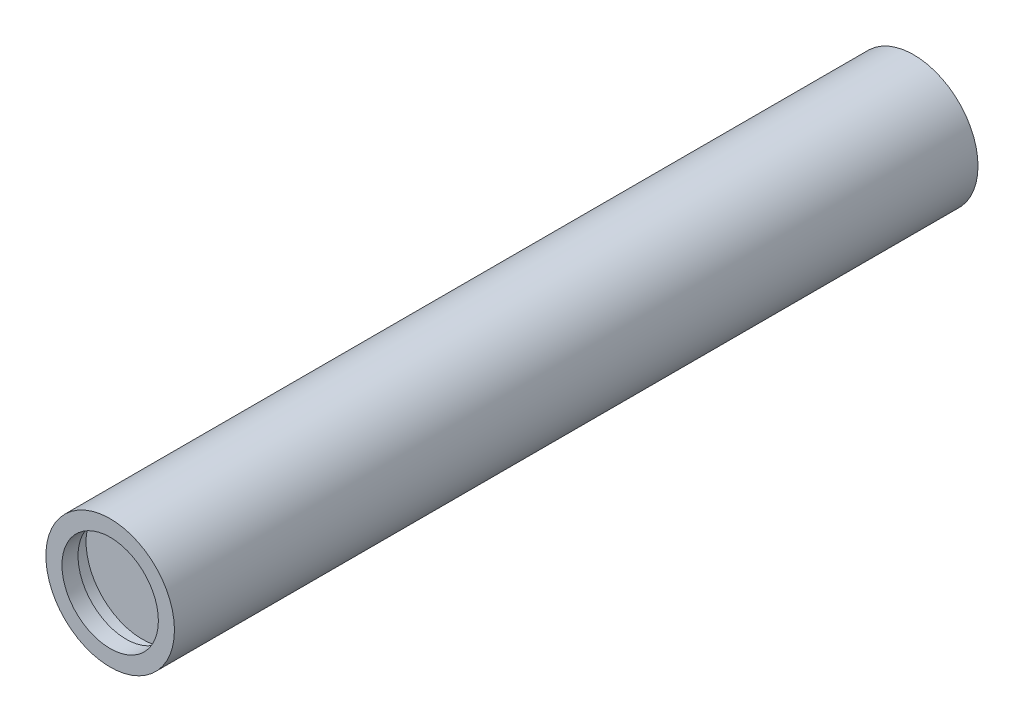
ISO-10303-21;
HEADER;
FILE_DESCRIPTION(('STEP AP214'),'2;1');
FILE_NAME('part.step','',(''),(''),'','','');
FILE_SCHEMA(('AUTOMOTIVE_DESIGN { 1 0 10303 214 1 1 1 1 }'));
ENDSEC;
DATA;
#1=APPLICATION_CONTEXT('core data for automotive mechanical design processes');
#2=APPLICATION_PROTOCOL_DEFINITION('international standard','automotive_design',2000,#1);
#3=PRODUCT_CONTEXT('',#1,'mechanical');
#4=PRODUCT('Part','Part','',(#3));
#5=PRODUCT_RELATED_PRODUCT_CATEGORY('part','',(#4));
#6=PRODUCT_DEFINITION_FORMATION('','',#4);
#7=PRODUCT_DEFINITION_CONTEXT('part definition',#1,'design');
#8=PRODUCT_DEFINITION('design','',#6,#7);
#9=PRODUCT_DEFINITION_SHAPE('','',#8);
#10=(LENGTH_UNIT() NAMED_UNIT(*) SI_UNIT(.MILLI.,.METRE.));
#11=(NAMED_UNIT(*) PLANE_ANGLE_UNIT() SI_UNIT($,.RADIAN.));
#12=(NAMED_UNIT(*) SI_UNIT($,.STERADIAN.) SOLID_ANGLE_UNIT());
#13=UNCERTAINTY_MEASURE_WITH_UNIT(LENGTH_MEASURE(1.E-05),#10,'distance_accuracy_value','');
#14=(GEOMETRIC_REPRESENTATION_CONTEXT(3) GLOBAL_UNCERTAINTY_ASSIGNED_CONTEXT((#13)) GLOBAL_UNIT_ASSIGNED_CONTEXT((#10,
#11,#12)) REPRESENTATION_CONTEXT('',''));
#15=CARTESIAN_POINT('',(0.,0.,0.));
#16=DIRECTION('',(0.,0.,1.));
#17=DIRECTION('',(1.,0.,0.));
#18=AXIS2_PLACEMENT_3D('',#15,#16,#17);
#19=CARTESIAN_POINT('',(0.,0.,500.));
#20=DIRECTION('',(0.,0.,1.));
#21=DIRECTION('',(1.,0.,0.));
#22=AXIS2_PLACEMENT_3D('',#19,#20,#21);
#23=PLANE('',#22);
#24=CARTESIAN_POINT('',(0.,0.,500.));
#25=DIRECTION('',(0.,0.,1.));
#26=DIRECTION('',(1.,0.,0.));
#27=AXIS2_PLACEMENT_3D('',#24,#25,#26);
#28=CIRCLE('',#27,40.);
#29=CARTESIAN_POINT('',(40.,0.,500.));
#30=VERTEX_POINT('',#29);
#31=EDGE_CURVE('E10',#30,#30,#28,.T.);
#32=ORIENTED_EDGE('',*,*,#31,.T.);
#33=EDGE_LOOP('',(#32));
#34=FACE_BOUND('',#33,.T.);
#35=CARTESIAN_POINT('',(0.,0.,500.));
#36=DIRECTION('',(0.,0.,-1.));
#37=DIRECTION('',(-1.,0.,0.));
#38=AXIS2_PLACEMENT_3D('',#35,#36,#37);
#39=CIRCLE('',#38,30.);
#40=CARTESIAN_POINT('',(-30.,0.,500.));
#41=VERTEX_POINT('',#40);
#42=EDGE_CURVE('E41',#41,#41,#39,.T.);
#43=ORIENTED_EDGE('',*,*,#42,.T.);
#44=EDGE_LOOP('',(#43));
#45=FACE_BOUND('',#44,.T.);
#46=ADVANCED_FACE('F30',(#34,#45),#23,.T.);
#47=CARTESIAN_POINT('',(0.,0.,500.));
#48=DIRECTION('',(0.,0.,-1.));
#49=DIRECTION('',(-1.,0.,0.));
#50=AXIS2_PLACEMENT_3D('',#47,#48,#49);
#51=CYLINDRICAL_SURFACE('',#50,40.);
#52=ORIENTED_EDGE('',*,*,#31,.F.);
#53=EDGE_LOOP('',(#52));
#54=FACE_BOUND('',#53,.T.);
#55=CARTESIAN_POINT('',(0.,0.,0.));
#56=DIRECTION('',(0.,0.,1.));
#57=DIRECTION('',(1.,0.,0.));
#58=AXIS2_PLACEMENT_3D('',#55,#56,#57);
#59=CIRCLE('',#58,40.);
#60=CARTESIAN_POINT('',(40.,0.,0.));
#61=VERTEX_POINT('',#60);
#62=EDGE_CURVE('E34',#61,#61,#59,.T.);
#63=ORIENTED_EDGE('',*,*,#62,.T.);
#64=EDGE_LOOP('',(#63));
#65=FACE_BOUND('',#64,.T.);
#66=ADVANCED_FACE('F32',(#54,#65),#51,.T.);
#67=CARTESIAN_POINT('',(0.,0.,0.));
#68=DIRECTION('',(0.,0.,1.));
#69=DIRECTION('',(1.,0.,0.));
#70=AXIS2_PLACEMENT_3D('',#67,#68,#69);
#71=PLANE('',#70);
#72=ORIENTED_EDGE('',*,*,#62,.F.);
#73=EDGE_LOOP('',(#72));
#74=FACE_BOUND('',#73,.T.);
#75=ADVANCED_FACE('F77',(#74),#71,.F.);
#76=CARTESIAN_POINT('',(0.,0.,490.));
#77=DIRECTION('',(0.,0.,1.));
#78=DIRECTION('',(1.,0.,0.));
#79=AXIS2_PLACEMENT_3D('',#76,#77,#78);
#80=CYLINDRICAL_SURFACE('',#79,30.);
#81=CARTESIAN_POINT('',(0.,0.,490.));
#82=DIRECTION('',(0.,0.,1.));
#83=DIRECTION('',(1.,0.,0.));
#84=AXIS2_PLACEMENT_3D('',#81,#82,#83);
#85=CIRCLE('',#84,30.);
#86=CARTESIAN_POINT('',(30.,0.,490.));
#87=VERTEX_POINT('',#86);
#88=EDGE_CURVE('E45',#87,#87,#85,.T.);
#89=ORIENTED_EDGE('',*,*,#88,.F.);
#90=EDGE_LOOP('',(#89));
#91=FACE_BOUND('',#90,.T.);
#92=ORIENTED_EDGE('',*,*,#42,.F.);
#93=EDGE_LOOP('',(#92));
#94=FACE_BOUND('',#93,.T.);
#95=ADVANCED_FACE('F60',(#91,#94),#80,.F.);
#96=CARTESIAN_POINT('',(0.,0.,480.));
#97=DIRECTION('',(0.,0.,1.));
#98=DIRECTION('',(1.,0.,0.));
#99=AXIS2_PLACEMENT_3D('',#96,#97,#98);
#100=CYLINDRICAL_SURFACE('',#99,35.);
#101=CARTESIAN_POINT('',(0.,0.,480.));
#102=DIRECTION('',(0.,0.,1.));
#103=DIRECTION('',(1.,0.,0.));
#104=AXIS2_PLACEMENT_3D('',#101,#102,#103);
#105=CIRCLE('',#104,35.);
#106=CARTESIAN_POINT('',(35.,0.,480.));
#107=VERTEX_POINT('',#106);
#108=EDGE_CURVE('E48',#107,#107,#105,.T.);
#109=ORIENTED_EDGE('',*,*,#108,.F.);
#110=EDGE_LOOP('',(#109));
#111=FACE_BOUND('',#110,.T.);
#112=CARTESIAN_POINT('',(0.,0.,490.));
#113=DIRECTION('',(0.,0.,1.));
#114=DIRECTION('',(1.,0.,0.));
#115=AXIS2_PLACEMENT_3D('',#112,#113,#114);
#116=CIRCLE('',#115,35.);
#117=CARTESIAN_POINT('',(35.,0.,490.));
#118=VERTEX_POINT('',#117);
#119=EDGE_CURVE('E49',#118,#118,#116,.T.);
#120=ORIENTED_EDGE('',*,*,#119,.T.);
#121=EDGE_LOOP('',(#120));
#122=FACE_BOUND('',#121,.T.);
#123=ADVANCED_FACE('F57',(#111,#122),#100,.F.);
#124=CARTESIAN_POINT('',(0.,0.,480.));
#125=DIRECTION('',(0.,0.,1.));
#126=DIRECTION('',(1.,0.,0.));
#127=AXIS2_PLACEMENT_3D('',#124,#125,#126);
#128=PLANE('',#127);
#129=ORIENTED_EDGE('',*,*,#108,.T.);
#130=EDGE_LOOP('',(#129));
#131=FACE_BOUND('',#130,.T.);
#132=ADVANCED_FACE('F55',(#131),#128,.T.);
#133=CARTESIAN_POINT('',(0.,0.,490.));
#134=DIRECTION('',(0.,0.,1.));
#135=DIRECTION('',(1.,0.,0.));
#136=AXIS2_PLACEMENT_3D('',#133,#134,#135);
#137=PLANE('',#136);
#138=ORIENTED_EDGE('',*,*,#88,.T.);
#139=EDGE_LOOP('',(#138));
#140=FACE_BOUND('',#139,.T.);
#141=ORIENTED_EDGE('',*,*,#119,.F.);
#142=EDGE_LOOP('',(#141));
#143=FACE_BOUND('',#142,.T.);
#144=ADVANCED_FACE('F64',(#140,#143),#137,.F.);
#145=CLOSED_SHELL('',(#46,#66,#75,#95,#123,#132,#144));
#146=MANIFOLD_SOLID_BREP('B2',#145);
#147=ADVANCED_BREP_SHAPE_REPRESENTATION('',(#18,#146),#14);
#148=SHAPE_DEFINITION_REPRESENTATION(#9,#147);
ENDSEC;
END-ISO-10303-21;
